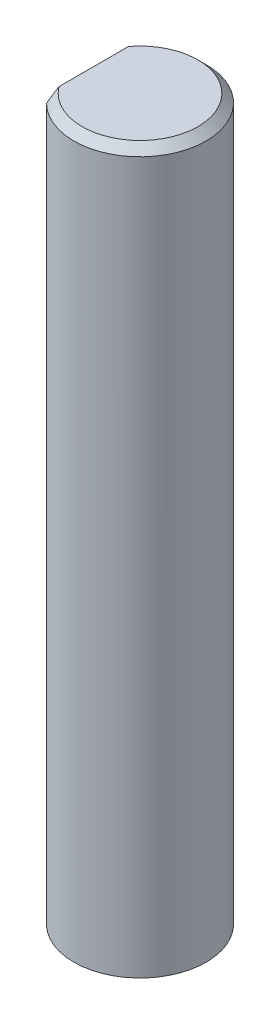
ISO-10303-21;
HEADER;
FILE_DESCRIPTION(('STEP AP214'),'2;1');
FILE_NAME('part.step','',(''),(''),'','','');
FILE_SCHEMA(('AUTOMOTIVE_DESIGN { 1 0 10303 214 1 1 1 1 }'));
ENDSEC;
DATA;
#1=APPLICATION_CONTEXT('core data for automotive mechanical design processes');
#2=APPLICATION_PROTOCOL_DEFINITION('international standard','automotive_design',2000,#1);
#3=PRODUCT_CONTEXT('',#1,'mechanical');
#4=PRODUCT('Part','Part','',(#3));
#5=PRODUCT_RELATED_PRODUCT_CATEGORY('part','',(#4));
#6=PRODUCT_DEFINITION_FORMATION('','',#4);
#7=PRODUCT_DEFINITION_CONTEXT('part definition',#1,'design');
#8=PRODUCT_DEFINITION('design','',#6,#7);
#9=PRODUCT_DEFINITION_SHAPE('','',#8);
#10=(LENGTH_UNIT() NAMED_UNIT(*) SI_UNIT(.MILLI.,.METRE.));
#11=(NAMED_UNIT(*) PLANE_ANGLE_UNIT() SI_UNIT($,.RADIAN.));
#12=(NAMED_UNIT(*) SI_UNIT($,.STERADIAN.) SOLID_ANGLE_UNIT());
#13=UNCERTAINTY_MEASURE_WITH_UNIT(LENGTH_MEASURE(1.E-05),#10,'distance_accuracy_value','');
#14=(GEOMETRIC_REPRESENTATION_CONTEXT(3) GLOBAL_UNCERTAINTY_ASSIGNED_CONTEXT((#13)) GLOBAL_UNIT_ASSIGNED_CONTEXT((#10,
#11,#12)) REPRESENTATION_CONTEXT('',''));
#15=CARTESIAN_POINT('',(0.,0.,0.));
#16=DIRECTION('',(0.,0.,1.));
#17=DIRECTION('',(1.,0.,0.));
#18=AXIS2_PLACEMENT_3D('',#15,#16,#17);
#19=CARTESIAN_POINT('',(0.,21.75,0.));
#20=DIRECTION('',(0.,-1.,0.));
#21=DIRECTION('',(0.,0.,-1.));
#22=AXIS2_PLACEMENT_3D('',#19,#20,#21);
#23=CYLINDRICAL_SURFACE('',#22,2.);
#24=CARTESIAN_POINT('',(0.,0.,0.));
#25=DIRECTION('',(0.,1.,0.));
#26=DIRECTION('',(0.,0.,1.));
#27=AXIS2_PLACEMENT_3D('',#24,#25,#26);
#28=CIRCLE('',#27,2.);
#29=CARTESIAN_POINT('',(0.,0.,2.));
#30=VERTEX_POINT('',#29);
#31=EDGE_CURVE('E81',#30,#30,#28,.T.);
#32=ORIENTED_EDGE('',*,*,#31,.T.);
#33=EDGE_LOOP('',(#32));
#34=FACE_BOUND('',#33,.T.);
#35=CARTESIAN_POINT('',(0.,9.75,0.));
#36=DIRECTION('',(0.,1.,0.));
#37=DIRECTION('',(0.,0.,1.));
#38=AXIS2_PLACEMENT_3D('',#35,#36,#37);
#39=CIRCLE('',#38,2.);
#40=CARTESIAN_POINT('',(-1.4,9.75,-1.42828568570857));
#41=VERTEX_POINT('',#40);
#42=CARTESIAN_POINT('',(-1.4,9.75,1.42828568570857));
#43=VERTEX_POINT('',#42);
#44=EDGE_CURVE('E12',#41,#43,#39,.T.);
#45=ORIENTED_EDGE('',*,*,#44,.F.);
#46=DIRECTION('',(0.,1.,0.));
#47=VECTOR('',#46,1.);
#48=CARTESIAN_POINT('',(-1.4,9.75,-1.42828568570857));
#49=LINE('',#48,#47);
#50=CARTESIAN_POINT('',(-1.4,21.5,-1.42828568570857));
#51=VERTEX_POINT('',#50);
#52=EDGE_CURVE('E67',#41,#51,#49,.T.);
#53=ORIENTED_EDGE('',*,*,#52,.T.);
#54=CARTESIAN_POINT('',(0.,21.5,0.));
#55=DIRECTION('',(0.,1.,0.));
#56=DIRECTION('',(0.,0.,1.));
#57=AXIS2_PLACEMENT_3D('',#54,#55,#56);
#58=CIRCLE('',#57,2.);
#59=CARTESIAN_POINT('',(-1.4,21.5,1.42828568570857));
#60=VERTEX_POINT('',#59);
#61=EDGE_CURVE('E80',#51,#60,#58,.F.);
#62=ORIENTED_EDGE('',*,*,#61,.T.);
#63=DIRECTION('',(0.,1.,0.));
#64=VECTOR('',#63,1.);
#65=CARTESIAN_POINT('',(-1.4,9.75,1.42828568570857));
#66=LINE('',#65,#64);
#67=EDGE_CURVE('E52',#43,#60,#66,.T.);
#68=ORIENTED_EDGE('',*,*,#67,.F.);
#69=EDGE_LOOP('',(#45,#53,#62,#68));
#70=FACE_BOUND('',#69,.T.);
#71=ADVANCED_FACE('F35',(#34,#70),#23,.T.);
#72=CARTESIAN_POINT('',(0.,21.75,0.));
#73=DIRECTION('',(0.,1.,0.));
#74=DIRECTION('',(0.,0.,1.));
#75=AXIS2_PLACEMENT_3D('',#72,#73,#74);
#76=PLANE('',#75);
#77=CARTESIAN_POINT('',(0.,21.75,0.));
#78=DIRECTION('',(0.,1.,0.));
#79=DIRECTION('',(0.,0.,1.));
#80=AXIS2_PLACEMENT_3D('',#77,#78,#79);
#81=CIRCLE('',#80,1.75);
#82=CARTESIAN_POINT('',(-1.4,21.75,1.05));
#83=VERTEX_POINT('',#82);
#84=CARTESIAN_POINT('',(-1.4,21.75,-1.05));
#85=VERTEX_POINT('',#84);
#86=EDGE_CURVE('E84',#83,#85,#81,.T.);
#87=ORIENTED_EDGE('',*,*,#86,.T.);
#88=DIRECTION('',(0.,0.,1.));
#89=VECTOR('',#88,1.);
#90=CARTESIAN_POINT('',(-1.4,21.75,-1.42828568570857));
#91=LINE('',#90,#89);
#92=EDGE_CURVE('E78',#85,#83,#91,.T.);
#93=ORIENTED_EDGE('',*,*,#92,.T.);
#94=EDGE_LOOP('',(#87,#93));
#95=FACE_BOUND('',#94,.T.);
#96=ADVANCED_FACE('F102',(#95),#76,.T.);
#97=CARTESIAN_POINT('',(0.,21.75,0.));
#98=DIRECTION('',(0.,-1.,0.));
#99=DIRECTION('',(0.,0.,-1.));
#100=AXIS2_PLACEMENT_3D('',#97,#98,#99);
#101=CONICAL_SURFACE('',#100,1.75,0.785398163397445);
#102=ORIENTED_EDGE('',*,*,#61,.F.);
#103=CARTESIAN_POINT('',(-1.4,21.49950004,-1.42898568570857));
#104=CARTESIAN_POINT('',(-1.4,21.5275639723333,-1.38968608817246));
#105=CARTESIAN_POINT('',(-1.4,21.5552655412638,-1.35012265291283));
#106=CARTESIAN_POINT('',(-1.4,21.6097730238219,-1.27035997764374));
#107=CARTESIAN_POINT('',(-1.4,21.6365785548209,-1.2301604765481));
#108=CARTESIAN_POINT('',(-1.4,21.6894152911542,-1.14856215403466));
#109=CARTESIAN_POINT('',(-1.4,21.7154332844783,-1.10715471963756));
#110=CARTESIAN_POINT('',(-1.4,21.766083095888,-1.02350878809917));
#111=CARTESIAN_POINT('',(-1.4,21.7907150642656,-0.981270381736255));
#112=CARTESIAN_POINT('',(-1.4,21.8637714309242,-0.850108909472726));
#113=CARTESIAN_POINT('',(-1.4,21.9094416542875,-0.759608534595294));
#114=CARTESIAN_POINT('',(-1.4,21.9892181380695,-0.57392510222067));
#115=CARTESIAN_POINT('',(-1.4,22.0233850053264,-0.478769711320206));
#116=CARTESIAN_POINT('',(-1.4,22.0610580021289,-0.335438929706541));
#117=CARTESIAN_POINT('',(-1.4,22.0712249149363,-0.289014562422255));
#118=CARTESIAN_POINT('',(-1.4,22.0871821257176,-0.195392855318707));
#119=CARTESIAN_POINT('',(-1.4,22.0929716455445,-0.148195379590641));
#120=CARTESIAN_POINT('',(-1.4,22.0997262097818,-0.0541554072904238));
#121=CARTESIAN_POINT('',(-1.4,22.1007615767218,-0.00731803744033345));
#122=CARTESIAN_POINT('',(-1.4,22.0981269024554,0.0862214726612429));
#123=CARTESIAN_POINT('',(-1.4,22.0944568798922,0.132923613447783));
#124=CARTESIAN_POINT('',(-1.4,22.0826992258492,0.22547239764998));
#125=CARTESIAN_POINT('',(-1.4,22.0746383312249,0.271322499302385));
#126=CARTESIAN_POINT('',(-1.4,22.0545934282697,0.362168063875975));
#127=CARTESIAN_POINT('',(-1.4,22.042606988866,0.407162978867561));
#128=CARTESIAN_POINT('',(-1.4,22.0012788096553,0.541788920755757));
#129=CARTESIAN_POINT('',(-1.4,21.966751509079,0.629830853113406));
#130=CARTESIAN_POINT('',(-1.4,21.8984109289795,0.779981536671945));
#131=CARTESIAN_POINT('',(-1.4,21.8665934193664,0.843053078079849));
#132=CARTESIAN_POINT('',(-1.4,21.7991817238585,0.967210826304147));
#133=CARTESIAN_POINT('',(-1.4,21.7635844420939,1.02829535129964));
#134=CARTESIAN_POINT('',(-1.4,21.6908872599812,1.14673863976642));
#135=CARTESIAN_POINT('',(-1.4,21.6538776422098,1.20415366453645));
#136=CARTESIAN_POINT('',(-1.4,21.5779717394914,1.31754403129486));
#137=CARTESIAN_POINT('',(-1.4,21.5390797929511,1.37352226768349));
#138=CARTESIAN_POINT('',(-1.4,21.49950004,1.42898568570857));
#139=B_SPLINE_CURVE_WITH_KNOTS('',3,(#103,#104,#105,#106,#107,#108,#109,#110,#111,#112,#113,
#114,#115,#116,#117,#118,#119,#120,#121,#122,#123,#124,#125,#126,#127,#128,#129,#130,#131,#132,
#133,#134,#135,#136,#137,#138),.UNSPECIFIED.,.F.,.F.,(4,2,2,2,2,2,2,2,2,2,2,2,2,2,2,2,2,4),(0.,
0.144877429791502,0.289815955098033,0.436499882890049,0.583167874415256,0.886826052537844,
1.18885837535085,1.33125598185351,1.47367889571254,1.61398818267375,1.75429691371981,
1.89376067656115,2.0333109725439,2.31610035162326,2.52791411061878,2.73990271650717,
2.94478993286482,3.1492255364369),.UNSPECIFIED.);
#140=EDGE_CURVE('E45',#51,#85,#139,.T.);
#141=ORIENTED_EDGE('',*,*,#140,.T.);
#142=ORIENTED_EDGE('',*,*,#86,.F.);
#143=EDGE_CURVE('E90',#83,#60,#139,.T.);
#144=ORIENTED_EDGE('',*,*,#143,.T.);
#145=EDGE_LOOP('',(#102,#141,#142,#144));
#146=FACE_BOUND('',#145,.T.);
#147=ADVANCED_FACE('F38',(#146),#101,.T.);
#148=CARTESIAN_POINT('',(0.,0.,0.));
#149=DIRECTION('',(0.,1.,0.));
#150=DIRECTION('',(0.,0.,1.));
#151=AXIS2_PLACEMENT_3D('',#148,#149,#150);
#152=PLANE('',#151);
#153=ORIENTED_EDGE('',*,*,#31,.F.);
#154=EDGE_LOOP('',(#153));
#155=FACE_BOUND('',#154,.T.);
#156=ADVANCED_FACE('F101',(#155),#152,.F.);
#157=CARTESIAN_POINT('',(0.,9.75,0.));
#158=DIRECTION('',(0.,1.,0.));
#159=DIRECTION('',(0.,0.,1.));
#160=AXIS2_PLACEMENT_3D('',#157,#158,#159);
#161=PLANE('',#160);
#162=ORIENTED_EDGE('',*,*,#44,.T.);
#163=DIRECTION('',(0.,0.,1.));
#164=VECTOR('',#163,1.);
#165=CARTESIAN_POINT('',(-1.4,9.75,-1.42828568570857));
#166=LINE('',#165,#164);
#167=EDGE_CURVE('E70',#41,#43,#166,.T.);
#168=ORIENTED_EDGE('',*,*,#167,.F.);
#169=EDGE_LOOP('',(#162,#168));
#170=FACE_BOUND('',#169,.T.);
#171=ADVANCED_FACE('F77',(#170),#161,.T.);
#172=CARTESIAN_POINT('',(-1.4,9.75,-1.42828568570857));
#173=DIRECTION('',(-1.,0.,0.));
#174=DIRECTION('',(0.,0.,1.));
#175=AXIS2_PLACEMENT_3D('',#172,#173,#174);
#176=PLANE('',#175);
#177=ORIENTED_EDGE('',*,*,#52,.F.);
#178=ORIENTED_EDGE('',*,*,#167,.T.);
#179=ORIENTED_EDGE('',*,*,#67,.T.);
#180=ORIENTED_EDGE('',*,*,#143,.F.);
#181=ORIENTED_EDGE('',*,*,#92,.F.);
#182=ORIENTED_EDGE('',*,*,#140,.F.);
#183=EDGE_LOOP('',(#177,#178,#179,#180,#181,#182));
#184=FACE_BOUND('',#183,.T.);
#185=ADVANCED_FACE('F69',(#184),#176,.T.);
#186=CLOSED_SHELL('',(#71,#96,#147,#156,#171,#185));
#187=MANIFOLD_SOLID_BREP('B2',#186);
#188=ADVANCED_BREP_SHAPE_REPRESENTATION('',(#18,#187),#14);
#189=SHAPE_DEFINITION_REPRESENTATION(#9,#188);
ENDSEC;
END-ISO-10303-21;
